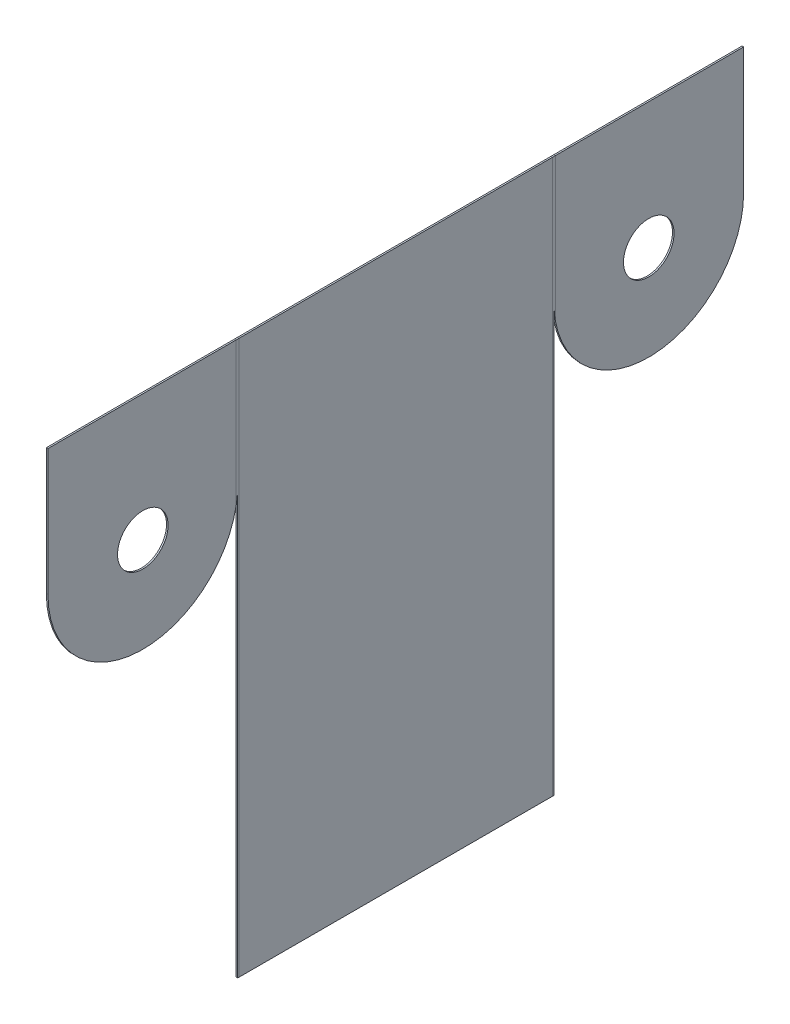
ISO-10303-21;
HEADER;
FILE_DESCRIPTION(('STEP AP214'),'2;1');
FILE_NAME('part.step','',(''),(''),'','','');
FILE_SCHEMA(('AUTOMOTIVE_DESIGN { 1 0 10303 214 1 1 1 1 }'));
ENDSEC;
DATA;
#1=APPLICATION_CONTEXT('core data for automotive mechanical design processes');
#2=APPLICATION_PROTOCOL_DEFINITION('international standard','automotive_design',2000,#1);
#3=PRODUCT_CONTEXT('',#1,'mechanical');
#4=PRODUCT('Part','Part','',(#3));
#5=PRODUCT_RELATED_PRODUCT_CATEGORY('part','',(#4));
#6=PRODUCT_DEFINITION_FORMATION('','',#4);
#7=PRODUCT_DEFINITION_CONTEXT('part definition',#1,'design');
#8=PRODUCT_DEFINITION('design','',#6,#7);
#9=PRODUCT_DEFINITION_SHAPE('','',#8);
#10=(LENGTH_UNIT() NAMED_UNIT(*) SI_UNIT(.MILLI.,.METRE.));
#11=(NAMED_UNIT(*) PLANE_ANGLE_UNIT() SI_UNIT($,.RADIAN.));
#12=(NAMED_UNIT(*) SI_UNIT($,.STERADIAN.) SOLID_ANGLE_UNIT());
#13=UNCERTAINTY_MEASURE_WITH_UNIT(LENGTH_MEASURE(1.E-05),#10,'distance_accuracy_value','');
#14=(GEOMETRIC_REPRESENTATION_CONTEXT(3) GLOBAL_UNCERTAINTY_ASSIGNED_CONTEXT((#13)) GLOBAL_UNIT_ASSIGNED_CONTEXT((#10,
#11,#12)) REPRESENTATION_CONTEXT('',''));
#15=CARTESIAN_POINT('',(0.,0.,0.));
#16=DIRECTION('',(0.,0.,1.));
#17=DIRECTION('',(1.,0.,0.));
#18=AXIS2_PLACEMENT_3D('',#15,#16,#17);
#19=CARTESIAN_POINT('',(99.2346233688582,0.,259.765376631143));
#20=DIRECTION('',(1.,0.,0.));
#21=DIRECTION('',(0.,0.,-1.));
#22=AXIS2_PLACEMENT_3D('',#19,#20,#21);
#23=PLANE('',#22);
#24=DIRECTION('',(0.,0.,1.));
#25=VECTOR('',#24,1.);
#26=CARTESIAN_POINT('',(99.2346233688569,80.,-120.234623368857));
#27=LINE('',#26,#25);
#28=CARTESIAN_POINT('',(99.2346233688573,80.,0.736600000000004));
#29=VERTEX_POINT('',#28);
#30=CARTESIAN_POINT('',(99.234623368858,80.,198.794153262285));
#31=VERTEX_POINT('',#30);
#32=EDGE_CURVE('E431',#29,#31,#27,.T.);
#33=ORIENTED_EDGE('',*,*,#32,.F.);
#34=DIRECTION('',(0.,-1.,0.));
#35=VECTOR('',#34,1.);
#36=CARTESIAN_POINT('',(99.2346233688573,0.,0.736600000000004));
#37=LINE('',#36,#35);
#38=CARTESIAN_POINT('',(99.2346233688573,-270.,0.73659999999999));
#39=VERTEX_POINT('',#38);
#40=EDGE_CURVE('E404',#29,#39,#37,.T.);
#41=ORIENTED_EDGE('',*,*,#40,.T.);
#42=DIRECTION('',(0.,0.,-1.));
#43=VECTOR('',#42,1.);
#44=CARTESIAN_POINT('',(99.2346233688573,-270.,-0.234623368857323));
#45=LINE('',#44,#43);
#46=CARTESIAN_POINT('',(99.234623368858,-270.,198.794153262285));
#47=VERTEX_POINT('',#46);
#48=EDGE_CURVE('E428',#47,#39,#45,.T.);
#49=ORIENTED_EDGE('',*,*,#48,.F.);
#50=DIRECTION('',(0.,-1.,0.));
#51=VECTOR('',#50,1.);
#52=CARTESIAN_POINT('',(99.234623368858,0.,198.794153262285));
#53=LINE('',#52,#51);
#54=EDGE_CURVE('E309',#31,#47,#53,.T.);
#55=ORIENTED_EDGE('',*,*,#54,.F.);
#56=EDGE_LOOP('',(#33,#41,#49,#55));
#57=FACE_BOUND('',#56,.T.);
#58=ADVANCED_FACE('F67',(#57),#23,.F.);
#59=CARTESIAN_POINT('',(99.2346233688573,-270.,-0.234623368857323));
#60=DIRECTION('',(0.,-1.,0.));
#61=DIRECTION('',(-1.,0.,0.));
#62=AXIS2_PLACEMENT_3D('',#59,#60,#61);
#63=PLANE('',#62);
#64=DIRECTION('',(-1.,0.,0.));
#65=VECTOR('',#64,1.);
#66=CARTESIAN_POINT('',(99.2346233688573,-270.,0.73659999999999));
#67=LINE('',#66,#65);
#68=CARTESIAN_POINT('',(100.234623368857,-270.,0.736600000000004));
#69=VERTEX_POINT('',#68);
#70=EDGE_CURVE('E312',#69,#39,#67,.T.);
#71=ORIENTED_EDGE('',*,*,#70,.F.);
#72=DIRECTION('',(0.,0.,-1.));
#73=VECTOR('',#72,1.);
#74=CARTESIAN_POINT('',(100.234623368857,-270.,-0.234623368857323));
#75=LINE('',#74,#73);
#76=CARTESIAN_POINT('',(100.234623368858,-270.,198.794153262285));
#77=VERTEX_POINT('',#76);
#78=EDGE_CURVE('E92',#77,#69,#75,.T.);
#79=ORIENTED_EDGE('',*,*,#78,.F.);
#80=DIRECTION('',(-1.,0.,0.));
#81=VECTOR('',#80,1.);
#82=CARTESIAN_POINT('',(99.234623368858,-270.,198.794153262285));
#83=LINE('',#82,#81);
#84=EDGE_CURVE('E311',#77,#47,#83,.T.);
#85=ORIENTED_EDGE('',*,*,#84,.T.);
#86=ORIENTED_EDGE('',*,*,#48,.T.);
#87=EDGE_LOOP('',(#71,#79,#85,#86));
#88=FACE_BOUND('',#87,.T.);
#89=ADVANCED_FACE('F69',(#88),#63,.T.);
#90=CARTESIAN_POINT('',(99.2346233688584,80.,319.765376631143));
#91=DIRECTION('',(0.,1.,0.));
#92=DIRECTION('',(1.,0.,0.));
#93=AXIS2_PLACEMENT_3D('',#90,#91,#92);
#94=PLANE('',#93);
#95=DIRECTION('',(1.,0.,0.));
#96=VECTOR('',#95,1.);
#97=CARTESIAN_POINT('',(99.2346233688573,80.,0.736600000000004));
#98=LINE('',#97,#96);
#99=CARTESIAN_POINT('',(100.234623368857,80.,0.736600000000004));
#100=VERTEX_POINT('',#99);
#101=EDGE_CURVE('E394',#29,#100,#98,.T.);
#102=ORIENTED_EDGE('',*,*,#101,.F.);
#103=ORIENTED_EDGE('',*,*,#32,.T.);
#104=DIRECTION('',(1.,0.,0.));
#105=VECTOR('',#104,1.);
#106=CARTESIAN_POINT('',(99.234623368858,80.,198.794153262285));
#107=LINE('',#106,#105);
#108=CARTESIAN_POINT('',(100.234623368858,80.,198.794153262285));
#109=VERTEX_POINT('',#108);
#110=EDGE_CURVE('E12',#31,#109,#107,.T.);
#111=ORIENTED_EDGE('',*,*,#110,.T.);
#112=DIRECTION('',(0.,0.,1.));
#113=VECTOR('',#112,1.);
#114=CARTESIAN_POINT('',(100.234623368858,80.,319.765376631143));
#115=LINE('',#114,#113);
#116=EDGE_CURVE('E390',#100,#109,#115,.T.);
#117=ORIENTED_EDGE('',*,*,#116,.F.);
#118=EDGE_LOOP('',(#102,#103,#111,#117));
#119=FACE_BOUND('',#118,.T.);
#120=ADVANCED_FACE('F375',(#119),#94,.T.);
#121=CARTESIAN_POINT('',(100.234623368858,0.,259.765376631143));
#122=DIRECTION('',(1.,0.,0.));
#123=DIRECTION('',(0.,0.,-1.));
#124=AXIS2_PLACEMENT_3D('',#121,#122,#123);
#125=PLANE('',#124);
#126=DIRECTION('',(0.,-1.,0.));
#127=VECTOR('',#126,1.);
#128=CARTESIAN_POINT('',(100.234623368857,0.,0.736600000000004));
#129=LINE('',#128,#127);
#130=EDGE_CURVE('E388',#100,#69,#129,.T.);
#131=ORIENTED_EDGE('',*,*,#130,.F.);
#132=ORIENTED_EDGE('',*,*,#116,.T.);
#133=DIRECTION('',(0.,-1.,0.));
#134=VECTOR('',#133,1.);
#135=CARTESIAN_POINT('',(100.234623368858,0.,198.794153262285));
#136=LINE('',#135,#134);
#137=EDGE_CURVE('E76',#109,#77,#136,.T.);
#138=ORIENTED_EDGE('',*,*,#137,.T.);
#139=ORIENTED_EDGE('',*,*,#78,.T.);
#140=EDGE_LOOP('',(#131,#132,#138,#139));
#141=FACE_BOUND('',#140,.T.);
#142=ADVANCED_FACE('F379',(#141),#125,.T.);
#143=CARTESIAN_POINT('',(99.7346233688573,80.,-0.234623368857285));
#144=DIRECTION('',(0.,-1.,0.));
#145=DIRECTION('',(0.,0.,1.));
#146=AXIS2_PLACEMENT_3D('',#143,#144,#145);
#147=PLANE('',#146);
#148=ORIENTED_EDGE('',*,*,#101,.T.);
#149=DIRECTION('',(0.,0.,1.));
#150=VECTOR('',#149,1.);
#151=CARTESIAN_POINT('',(100.234623368857,80.,-0.234623368857286));
#152=LINE('',#151,#150);
#153=CARTESIAN_POINT('',(100.234623368857,80.,-1.20584673771457));
#154=VERTEX_POINT('',#153);
#155=EDGE_CURVE('E400',#100,#154,#152,.F.);
#156=ORIENTED_EDGE('',*,*,#155,.T.);
#157=DIRECTION('',(1.,0.,0.));
#158=VECTOR('',#157,1.);
#159=CARTESIAN_POINT('',(99.2346233688573,80.,-1.20584673771457));
#160=LINE('',#159,#158);
#161=CARTESIAN_POINT('',(99.2346233688573,80.,-1.2058467377146));
#162=VERTEX_POINT('',#161);
#163=EDGE_CURVE('E463',#162,#154,#160,.T.);
#164=ORIENTED_EDGE('',*,*,#163,.F.);
#165=DIRECTION('',(0.,0.,1.));
#166=VECTOR('',#165,1.);
#167=CARTESIAN_POINT('',(99.2346233688573,80.,-0.234623368857283));
#168=LINE('',#167,#166);
#169=EDGE_CURVE('E306',#29,#162,#168,.F.);
#170=ORIENTED_EDGE('',*,*,#169,.F.);
#171=EDGE_LOOP('',(#148,#156,#164,#170));
#172=FACE_BOUND('',#171,.T.);
#173=ADVANCED_FACE('F287',(#172),#147,.F.);
#174=CARTESIAN_POINT('',(99.734623368857,1.2490009027033E-13,-60.2346233688573));
#175=DIRECTION('',(-1.,0.,0.));
#176=DIRECTION('',(0.,0.,1.));
#177=AXIS2_PLACEMENT_3D('',#174,#175,#176);
#178=CYLINDRICAL_SURFACE('',#177,60.);
#179=CARTESIAN_POINT('',(100.234623368857,-10.7519081762569,-1.20584673771456));
#180=DIRECTION('',(-1.,0.,0.));
#181=VECTOR('',#180,1.);
#182=LINE('',#179,#181);
#183=CARTESIAN_POINT('',(100.234623368857,-10.7519081762569,-1.20584673771457));
#184=VERTEX_POINT('',#183);
#185=CARTESIAN_POINT('',(99.2346233688573,-10.7519081762569,-1.20584673771457));
#186=VERTEX_POINT('',#185);
#187=EDGE_CURVE('E248',#184,#186,#182,.T.);
#188=ORIENTED_EDGE('',*,*,#187,.F.);
#189=CARTESIAN_POINT('',(100.234623368857,1.2490009027033E-13,-60.2346233688573));
#190=DIRECTION('',(-1.,0.,0.));
#191=DIRECTION('',(0.,0.,1.));
#192=AXIS2_PLACEMENT_3D('',#189,#190,#191);
#193=CIRCLE('',#192,60.);
#194=CARTESIAN_POINT('',(100.234623368857,1.25054974259178E-13,-0.234623368857285));
#195=VERTEX_POINT('',#194);
#196=EDGE_CURVE('E411',#184,#195,#193,.T.);
#197=ORIENTED_EDGE('',*,*,#196,.T.);
#198=DIRECTION('',(-1.,0.,0.));
#199=VECTOR('',#198,1.);
#200=CARTESIAN_POINT('',(99.7346233688573,1.2490009027033E-13,-0.234623368857281));
#201=LINE('',#200,#199);
#202=CARTESIAN_POINT('',(99.2346233688573,1.24745206281482E-13,-0.234623368857284));
#203=VERTEX_POINT('',#202);
#204=EDGE_CURVE('E423',#195,#203,#201,.T.);
#205=ORIENTED_EDGE('',*,*,#204,.T.);
#206=CARTESIAN_POINT('',(99.234623368857,1.2490009027033E-13,-60.2346233688573));
#207=DIRECTION('',(-1.,0.,0.));
#208=DIRECTION('',(0.,0.,1.));
#209=AXIS2_PLACEMENT_3D('',#206,#207,#208);
#210=CIRCLE('',#209,60.);
#211=EDGE_CURVE('E296',#186,#203,#210,.T.);
#212=ORIENTED_EDGE('',*,*,#211,.F.);
#213=EDGE_LOOP('',(#188,#197,#205,#212));
#214=FACE_BOUND('',#213,.T.);
#215=ADVANCED_FACE('F282',(#214),#178,.T.);
#216=CARTESIAN_POINT('',(99.7346233688573,-95.,-0.234623368857288));
#217=DIRECTION('',(0.,0.,1.));
#218=DIRECTION('',(0.,1.,0.));
#219=AXIS2_PLACEMENT_3D('',#216,#217,#218);
#220=PLANE('',#219);
#221=ORIENTED_EDGE('',*,*,#204,.F.);
#222=DIRECTION('',(0.,1.,0.));
#223=VECTOR('',#222,1.);
#224=CARTESIAN_POINT('',(100.234623368857,-95.,-0.234623368857289));
#225=LINE('',#224,#223);
#226=CARTESIAN_POINT('',(100.234623368857,-270.,-0.234623368857289));
#227=VERTEX_POINT('',#226);
#228=EDGE_CURVE('E414',#195,#227,#225,.F.);
#229=ORIENTED_EDGE('',*,*,#228,.T.);
#230=DIRECTION('',(-1.,0.,0.));
#231=VECTOR('',#230,1.);
#232=CARTESIAN_POINT('',(99.7346233688573,-270.,-0.234623368857288));
#233=LINE('',#232,#231);
#234=CARTESIAN_POINT('',(99.2346233688573,-270.,-0.234623368857286));
#235=VERTEX_POINT('',#234);
#236=EDGE_CURVE('E425',#227,#235,#233,.T.);
#237=ORIENTED_EDGE('',*,*,#236,.T.);
#238=DIRECTION('',(0.,1.,0.));
#239=VECTOR('',#238,1.);
#240=CARTESIAN_POINT('',(99.2346233688573,-95.,-0.234623368857286));
#241=LINE('',#240,#239);
#242=EDGE_CURVE('E305',#203,#235,#241,.F.);
#243=ORIENTED_EDGE('',*,*,#242,.F.);
#244=EDGE_LOOP('',(#221,#229,#237,#243));
#245=FACE_BOUND('',#244,.T.);
#246=ADVANCED_FACE('F279',(#245),#220,.F.);
#247=CARTESIAN_POINT('',(99.7346233688573,-270.,-0.234623368857285));
#248=DIRECTION('',(0.,-1.,0.));
#249=DIRECTION('',(0.,0.,1.));
#250=AXIS2_PLACEMENT_3D('',#247,#248,#249);
#251=PLANE('',#250);
#252=DIRECTION('',(0.,0.,1.));
#253=VECTOR('',#252,1.);
#254=CARTESIAN_POINT('',(100.234623368857,-270.,-0.234623368857286));
#255=LINE('',#254,#253);
#256=EDGE_CURVE('E421',#227,#69,#255,.T.);
#257=ORIENTED_EDGE('',*,*,#256,.T.);
#258=ORIENTED_EDGE('',*,*,#70,.T.);
#259=DIRECTION('',(0.,0.,1.));
#260=VECTOR('',#259,1.);
#261=CARTESIAN_POINT('',(99.2346233688573,-270.,-0.234623368857283));
#262=LINE('',#261,#260);
#263=EDGE_CURVE('E427',#235,#39,#262,.T.);
#264=ORIENTED_EDGE('',*,*,#263,.F.);
#265=ORIENTED_EDGE('',*,*,#236,.F.);
#266=EDGE_LOOP('',(#257,#258,#264,#265));
#267=FACE_BOUND('',#266,.T.);
#268=ADVANCED_FACE('F273',(#267),#251,.T.);
#269=CARTESIAN_POINT('',(99.2346233688573,-95.,-0.234623368857283));
#270=DIRECTION('',(-1.,0.,0.));
#271=DIRECTION('',(0.,0.,1.));
#272=AXIS2_PLACEMENT_3D('',#269,#270,#271);
#273=PLANE('',#272);
#274=ORIENTED_EDGE('',*,*,#242,.T.);
#275=ORIENTED_EDGE('',*,*,#263,.T.);
#276=ORIENTED_EDGE('',*,*,#40,.F.);
#277=ORIENTED_EDGE('',*,*,#169,.T.);
#278=DIRECTION('',(0.,-1.,0.));
#279=VECTOR('',#278,1.);
#280=CARTESIAN_POINT('',(99.2346233688573,0.,-1.20584673771457));
#281=LINE('',#280,#279);
#282=EDGE_CURVE('E243',#162,#186,#281,.T.);
#283=ORIENTED_EDGE('',*,*,#282,.T.);
#284=ORIENTED_EDGE('',*,*,#211,.T.);
#285=EDGE_LOOP('',(#274,#275,#276,#277,#283,#284));
#286=FACE_BOUND('',#285,.T.);
#287=ADVANCED_FACE('F269',(#286),#273,.T.);
#288=CARTESIAN_POINT('',(100.234623368857,-95.,-0.234623368857286));
#289=DIRECTION('',(-1.,0.,0.));
#290=DIRECTION('',(0.,0.,1.));
#291=AXIS2_PLACEMENT_3D('',#288,#289,#290);
#292=PLANE('',#291);
#293=ORIENTED_EDGE('',*,*,#228,.F.);
#294=ORIENTED_EDGE('',*,*,#196,.F.);
#295=DIRECTION('',(0.,-1.,0.));
#296=VECTOR('',#295,1.);
#297=CARTESIAN_POINT('',(100.234623368857,0.,-1.20584673771457));
#298=LINE('',#297,#296);
#299=EDGE_CURVE('E410',#154,#184,#298,.T.);
#300=ORIENTED_EDGE('',*,*,#299,.F.);
#301=ORIENTED_EDGE('',*,*,#155,.F.);
#302=ORIENTED_EDGE('',*,*,#130,.T.);
#303=ORIENTED_EDGE('',*,*,#256,.F.);
#304=EDGE_LOOP('',(#293,#294,#300,#301,#302,#303));
#305=FACE_BOUND('',#304,.T.);
#306=ADVANCED_FACE('F272',(#305),#292,.F.);
#307=CARTESIAN_POINT('',(99.2346233688571,0.,-60.2346233688573));
#308=DIRECTION('',(1.,0.,0.));
#309=DIRECTION('',(0.,0.,-1.));
#310=AXIS2_PLACEMENT_3D('',#307,#308,#309);
#311=CYLINDRICAL_SURFACE('',#310,16.);
#312=CARTESIAN_POINT('',(99.2346233688571,0.,-60.2346233688573));
#313=DIRECTION('',(1.,0.,0.));
#314=DIRECTION('',(0.,0.,-1.));
#315=AXIS2_PLACEMENT_3D('',#312,#313,#314);
#316=CIRCLE('',#315,16.);
#317=CARTESIAN_POINT('',(99.234623368857,0.,-76.2346233688573));
#318=VERTEX_POINT('',#317);
#319=EDGE_CURVE('E458',#318,#318,#316,.T.);
#320=ORIENTED_EDGE('',*,*,#319,.F.);
#321=EDGE_LOOP('',(#320));
#322=FACE_BOUND('',#321,.T.);
#323=CARTESIAN_POINT('',(100.234623368857,0.,-60.2346233688573));
#324=DIRECTION('',(1.,0.,0.));
#325=DIRECTION('',(0.,0.,-1.));
#326=AXIS2_PLACEMENT_3D('',#323,#324,#325);
#327=CIRCLE('',#326,16.);
#328=CARTESIAN_POINT('',(100.234623368857,0.,-76.2346233688573));
#329=VERTEX_POINT('',#328);
#330=EDGE_CURVE('E449',#329,#329,#327,.T.);
#331=ORIENTED_EDGE('',*,*,#330,.T.);
#332=EDGE_LOOP('',(#331));
#333=FACE_BOUND('',#332,.T.);
#334=ADVANCED_FACE('F277',(#322,#333),#311,.F.);
#335=CARTESIAN_POINT('',(99.2346233688569,0.,-120.234623368857));
#336=DIRECTION('',(0.,0.,-1.));
#337=DIRECTION('',(-1.,0.,0.));
#338=AXIS2_PLACEMENT_3D('',#335,#336,#337);
#339=PLANE('',#338);
#340=DIRECTION('',(0.,1.,0.));
#341=VECTOR('',#340,1.);
#342=CARTESIAN_POINT('',(100.234623368857,0.,-120.234623368857));
#343=LINE('',#342,#341);
#344=CARTESIAN_POINT('',(100.234623368857,0.,-120.234623368857));
#345=VERTEX_POINT('',#344);
#346=CARTESIAN_POINT('',(100.234623368857,80.,-120.234623368857));
#347=VERTEX_POINT('',#346);
#348=EDGE_CURVE('E475',#345,#347,#343,.T.);
#349=ORIENTED_EDGE('',*,*,#348,.F.);
#350=DIRECTION('',(1.,0.,0.));
#351=VECTOR('',#350,1.);
#352=CARTESIAN_POINT('',(99.2346233688569,0.,-120.234623368857));
#353=LINE('',#352,#351);
#354=CARTESIAN_POINT('',(99.2346233688569,0.,-120.234623368857));
#355=VERTEX_POINT('',#354);
#356=EDGE_CURVE('E254',#355,#345,#353,.T.);
#357=ORIENTED_EDGE('',*,*,#356,.F.);
#358=DIRECTION('',(0.,1.,0.));
#359=VECTOR('',#358,1.);
#360=CARTESIAN_POINT('',(99.2346233688569,0.,-120.234623368857));
#361=LINE('',#360,#359);
#362=CARTESIAN_POINT('',(99.2346233688569,80.,-120.234623368857));
#363=VERTEX_POINT('',#362);
#364=EDGE_CURVE('E452',#355,#363,#361,.T.);
#365=ORIENTED_EDGE('',*,*,#364,.T.);
#366=DIRECTION('',(1.,0.,0.));
#367=VECTOR('',#366,1.);
#368=CARTESIAN_POINT('',(99.2346233688569,80.,-120.234623368857));
#369=LINE('',#368,#367);
#370=EDGE_CURVE('E455',#363,#347,#369,.T.);
#371=ORIENTED_EDGE('',*,*,#370,.T.);
#372=EDGE_LOOP('',(#349,#357,#365,#371));
#373=FACE_BOUND('',#372,.T.);
#374=ADVANCED_FACE('F354',(#373),#339,.T.);
#375=CARTESIAN_POINT('',(99.2346233688582,0.,259.765376631143));
#376=DIRECTION('',(1.,0.,0.));
#377=DIRECTION('',(0.,0.,-1.));
#378=AXIS2_PLACEMENT_3D('',#375,#376,#377);
#379=PLANE('',#378);
#380=ORIENTED_EDGE('',*,*,#282,.F.);
#381=DIRECTION('',(0.,0.,1.));
#382=VECTOR('',#381,1.);
#383=CARTESIAN_POINT('',(99.2346233688569,80.,-120.234623368857));
#384=LINE('',#383,#382);
#385=EDGE_CURVE('E461',#363,#162,#384,.T.);
#386=ORIENTED_EDGE('',*,*,#385,.F.);
#387=ORIENTED_EDGE('',*,*,#364,.F.);
#388=CARTESIAN_POINT('',(99.2346233688571,0.,-60.2346233688573));
#389=DIRECTION('',(1.,0.,0.));
#390=DIRECTION('',(0.,0.,-1.));
#391=AXIS2_PLACEMENT_3D('',#388,#389,#390);
#392=CIRCLE('',#391,60.);
#393=EDGE_CURVE('E417',#186,#355,#392,.T.);
#394=ORIENTED_EDGE('',*,*,#393,.F.);
#395=EDGE_LOOP('',(#380,#386,#387,#394));
#396=FACE_BOUND('',#395,.T.);
#397=ORIENTED_EDGE('',*,*,#319,.T.);
#398=EDGE_LOOP('',(#397));
#399=FACE_BOUND('',#398,.T.);
#400=ADVANCED_FACE('F358',(#396,#399),#379,.F.);
#401=CARTESIAN_POINT('',(99.2346233688584,80.,319.765376631143));
#402=DIRECTION('',(0.,1.,0.));
#403=DIRECTION('',(1.,0.,0.));
#404=AXIS2_PLACEMENT_3D('',#401,#402,#403);
#405=PLANE('',#404);
#406=ORIENTED_EDGE('',*,*,#385,.T.);
#407=ORIENTED_EDGE('',*,*,#163,.T.);
#408=DIRECTION('',(0.,0.,1.));
#409=VECTOR('',#408,1.);
#410=CARTESIAN_POINT('',(100.234623368858,80.,319.765376631143));
#411=LINE('',#410,#409);
#412=EDGE_CURVE('E466',#347,#154,#411,.T.);
#413=ORIENTED_EDGE('',*,*,#412,.F.);
#414=ORIENTED_EDGE('',*,*,#370,.F.);
#415=EDGE_LOOP('',(#406,#407,#413,#414));
#416=FACE_BOUND('',#415,.T.);
#417=ADVANCED_FACE('F361',(#416),#405,.T.);
#418=CARTESIAN_POINT('',(100.234623368858,0.,259.765376631143));
#419=DIRECTION('',(1.,0.,0.));
#420=DIRECTION('',(0.,0.,-1.));
#421=AXIS2_PLACEMENT_3D('',#418,#419,#420);
#422=PLANE('',#421);
#423=ORIENTED_EDGE('',*,*,#330,.F.);
#424=EDGE_LOOP('',(#423));
#425=FACE_BOUND('',#424,.T.);
#426=ORIENTED_EDGE('',*,*,#412,.T.);
#427=ORIENTED_EDGE('',*,*,#299,.T.);
#428=CARTESIAN_POINT('',(100.234623368857,0.,-60.2346233688573));
#429=DIRECTION('',(1.,0.,0.));
#430=DIRECTION('',(0.,0.,-1.));
#431=AXIS2_PLACEMENT_3D('',#428,#429,#430);
#432=CIRCLE('',#431,60.);
#433=EDGE_CURVE('E471',#184,#345,#432,.T.);
#434=ORIENTED_EDGE('',*,*,#433,.T.);
#435=ORIENTED_EDGE('',*,*,#348,.T.);
#436=EDGE_LOOP('',(#426,#427,#434,#435));
#437=FACE_BOUND('',#436,.T.);
#438=ADVANCED_FACE('F267',(#425,#437),#422,.T.);
#439=CARTESIAN_POINT('',(99.2346233688571,0.,-60.2346233688573));
#440=DIRECTION('',(1.,0.,0.));
#441=DIRECTION('',(0.,0.,-1.));
#442=AXIS2_PLACEMENT_3D('',#439,#440,#441);
#443=CYLINDRICAL_SURFACE('',#442,60.);
#444=ORIENTED_EDGE('',*,*,#433,.F.);
#445=ORIENTED_EDGE('',*,*,#187,.T.);
#446=ORIENTED_EDGE('',*,*,#393,.T.);
#447=ORIENTED_EDGE('',*,*,#356,.T.);
#448=EDGE_LOOP('',(#444,#445,#446,#447));
#449=FACE_BOUND('',#448,.T.);
#450=ADVANCED_FACE('F256',(#449),#443,.T.);
#451=CARTESIAN_POINT('',(99.734623368858,-270.,199.765376631143));
#452=DIRECTION('',(0.,-1.,0.));
#453=DIRECTION('',(0.,0.,1.));
#454=AXIS2_PLACEMENT_3D('',#451,#452,#453);
#455=PLANE('',#454);
#456=ORIENTED_EDGE('',*,*,#84,.F.);
#457=DIRECTION('',(0.,0.,1.));
#458=VECTOR('',#457,1.);
#459=CARTESIAN_POINT('',(100.234623368858,-270.,199.765376631143));
#460=LINE('',#459,#458);
#461=CARTESIAN_POINT('',(100.234623368858,-270.,199.765376631143));
#462=VERTEX_POINT('',#461);
#463=EDGE_CURVE('E202',#77,#462,#460,.T.);
#464=ORIENTED_EDGE('',*,*,#463,.T.);
#465=DIRECTION('',(-1.,0.,0.));
#466=VECTOR('',#465,1.);
#467=CARTESIAN_POINT('',(99.734623368858,-270.,199.765376631143));
#468=LINE('',#467,#466);
#469=CARTESIAN_POINT('',(99.234623368858,-270.,199.765376631143));
#470=VERTEX_POINT('',#469);
#471=EDGE_CURVE('E241',#462,#470,#468,.T.);
#472=ORIENTED_EDGE('',*,*,#471,.T.);
#473=DIRECTION('',(0.,0.,1.));
#474=VECTOR('',#473,1.);
#475=CARTESIAN_POINT('',(99.234623368858,-270.,199.765376631143));
#476=LINE('',#475,#474);
#477=EDGE_CURVE('E226',#47,#470,#476,.T.);
#478=ORIENTED_EDGE('',*,*,#477,.F.);
#479=EDGE_LOOP('',(#456,#464,#472,#478));
#480=FACE_BOUND('',#479,.T.);
#481=ADVANCED_FACE('F266',(#480),#455,.T.);
#482=CARTESIAN_POINT('',(99.734623368858,-95.,199.765376631143));
#483=DIRECTION('',(0.,0.,1.));
#484=DIRECTION('',(0.,1.,0.));
#485=AXIS2_PLACEMENT_3D('',#482,#483,#484);
#486=PLANE('',#485);
#487=ORIENTED_EDGE('',*,*,#471,.F.);
#488=DIRECTION('',(0.,1.,0.));
#489=VECTOR('',#488,1.);
#490=CARTESIAN_POINT('',(100.234623368858,-95.,199.765376631143));
#491=LINE('',#490,#489);
#492=CARTESIAN_POINT('',(100.234623368858,0.,199.765376631143));
#493=VERTEX_POINT('',#492);
#494=EDGE_CURVE('E233',#462,#493,#491,.T.);
#495=ORIENTED_EDGE('',*,*,#494,.T.);
#496=DIRECTION('',(-1.,0.,0.));
#497=VECTOR('',#496,1.);
#498=CARTESIAN_POINT('',(99.734623368858,0.,199.765376631143));
#499=LINE('',#498,#497);
#500=CARTESIAN_POINT('',(99.234623368858,0.,199.765376631143));
#501=VERTEX_POINT('',#500);
#502=EDGE_CURVE('E232',#493,#501,#499,.T.);
#503=ORIENTED_EDGE('',*,*,#502,.T.);
#504=DIRECTION('',(0.,1.,0.));
#505=VECTOR('',#504,1.);
#506=CARTESIAN_POINT('',(99.234623368858,-95.,199.765376631143));
#507=LINE('',#506,#505);
#508=EDGE_CURVE('E222',#470,#501,#507,.T.);
#509=ORIENTED_EDGE('',*,*,#508,.F.);
#510=EDGE_LOOP('',(#487,#495,#503,#509));
#511=FACE_BOUND('',#510,.T.);
#512=ADVANCED_FACE('F340',(#511),#486,.T.);
#513=CARTESIAN_POINT('',(99.7346233688583,0.,259.765376631143));
#514=DIRECTION('',(-1.,0.,0.));
#515=DIRECTION('',(0.,0.,1.));
#516=AXIS2_PLACEMENT_3D('',#513,#514,#515);
#517=CYLINDRICAL_SURFACE('',#516,60.);
#518=ORIENTED_EDGE('',*,*,#502,.F.);
#519=CARTESIAN_POINT('',(100.234623368858,0.,259.765376631143));
#520=DIRECTION('',(-1.,0.,0.));
#521=DIRECTION('',(0.,0.,1.));
#522=AXIS2_PLACEMENT_3D('',#519,#520,#521);
#523=CIRCLE('',#522,60.);
#524=CARTESIAN_POINT('',(100.234623368858,-10.7519081762569,200.7366));
#525=VERTEX_POINT('',#524);
#526=EDGE_CURVE('E236',#493,#525,#523,.T.);
#527=ORIENTED_EDGE('',*,*,#526,.T.);
#528=CARTESIAN_POINT('',(100.234623368858,-10.7519081762569,200.7366));
#529=DIRECTION('',(-1.,0.,0.));
#530=VECTOR('',#529,1.);
#531=LINE('',#528,#530);
#532=CARTESIAN_POINT('',(99.234623368858,-10.7519081762569,200.7366));
#533=VERTEX_POINT('',#532);
#534=EDGE_CURVE('E209',#525,#533,#531,.T.);
#535=ORIENTED_EDGE('',*,*,#534,.T.);
#536=CARTESIAN_POINT('',(99.2346233688583,0.,259.765376631143));
#537=DIRECTION('',(-1.,0.,0.));
#538=DIRECTION('',(0.,0.,1.));
#539=AXIS2_PLACEMENT_3D('',#536,#537,#538);
#540=CIRCLE('',#539,60.);
#541=EDGE_CURVE('E225',#501,#533,#540,.T.);
#542=ORIENTED_EDGE('',*,*,#541,.F.);
#543=EDGE_LOOP('',(#518,#527,#535,#542));
#544=FACE_BOUND('',#543,.T.);
#545=ADVANCED_FACE('F329',(#544),#517,.T.);
#546=CARTESIAN_POINT('',(99.734623368858,80.,199.765376631143));
#547=DIRECTION('',(0.,-1.,0.));
#548=DIRECTION('',(0.,0.,1.));
#549=AXIS2_PLACEMENT_3D('',#546,#547,#548);
#550=PLANE('',#549);
#551=DIRECTION('',(0.,0.,1.));
#552=VECTOR('',#551,1.);
#553=CARTESIAN_POINT('',(100.234623368858,80.,199.765376631143));
#554=LINE('',#553,#552);
#555=CARTESIAN_POINT('',(100.234623368858,80.,200.7366));
#556=VERTEX_POINT('',#555);
#557=EDGE_CURVE('E84',#556,#109,#554,.F.);
#558=ORIENTED_EDGE('',*,*,#557,.T.);
#559=ORIENTED_EDGE('',*,*,#110,.F.);
#560=DIRECTION('',(0.,0.,1.));
#561=VECTOR('',#560,1.);
#562=CARTESIAN_POINT('',(99.234623368858,80.,199.765376631143));
#563=LINE('',#562,#561);
#564=CARTESIAN_POINT('',(99.234623368858,80.,200.7366));
#565=VERTEX_POINT('',#564);
#566=EDGE_CURVE('E229',#565,#31,#563,.F.);
#567=ORIENTED_EDGE('',*,*,#566,.F.);
#568=DIRECTION('',(1.,0.,0.));
#569=VECTOR('',#568,1.);
#570=CARTESIAN_POINT('',(99.234623368858,80.,200.7366));
#571=LINE('',#570,#569);
#572=EDGE_CURVE('E190',#565,#556,#571,.T.);
#573=ORIENTED_EDGE('',*,*,#572,.T.);
#574=EDGE_LOOP('',(#558,#559,#567,#573));
#575=FACE_BOUND('',#574,.T.);
#576=ADVANCED_FACE('F339',(#575),#550,.F.);
#577=CARTESIAN_POINT('',(99.234623368858,-95.,199.765376631143));
#578=DIRECTION('',(-1.,0.,0.));
#579=DIRECTION('',(0.,0.,1.));
#580=AXIS2_PLACEMENT_3D('',#577,#578,#579);
#581=PLANE('',#580);
#582=DIRECTION('',(0.,-1.,0.));
#583=VECTOR('',#582,1.);
#584=CARTESIAN_POINT('',(99.234623368858,0.,200.7366));
#585=LINE('',#584,#583);
#586=EDGE_CURVE('E501',#565,#533,#585,.T.);
#587=ORIENTED_EDGE('',*,*,#586,.F.);
#588=ORIENTED_EDGE('',*,*,#566,.T.);
#589=ORIENTED_EDGE('',*,*,#54,.T.);
#590=ORIENTED_EDGE('',*,*,#477,.T.);
#591=ORIENTED_EDGE('',*,*,#508,.T.);
#592=ORIENTED_EDGE('',*,*,#541,.T.);
#593=EDGE_LOOP('',(#587,#588,#589,#590,#591,#592));
#594=FACE_BOUND('',#593,.T.);
#595=ADVANCED_FACE('F351',(#594),#581,.T.);
#596=CARTESIAN_POINT('',(100.234623368858,-95.,199.765376631143));
#597=DIRECTION('',(-1.,0.,0.));
#598=DIRECTION('',(0.,0.,1.));
#599=AXIS2_PLACEMENT_3D('',#596,#597,#598);
#600=PLANE('',#599);
#601=DIRECTION('',(0.,-1.,0.));
#602=VECTOR('',#601,1.);
#603=CARTESIAN_POINT('',(100.234623368858,0.,200.7366));
#604=LINE('',#603,#602);
#605=EDGE_CURVE('E214',#556,#525,#604,.T.);
#606=ORIENTED_EDGE('',*,*,#605,.T.);
#607=ORIENTED_EDGE('',*,*,#526,.F.);
#608=ORIENTED_EDGE('',*,*,#494,.F.);
#609=ORIENTED_EDGE('',*,*,#463,.F.);
#610=ORIENTED_EDGE('',*,*,#137,.F.);
#611=ORIENTED_EDGE('',*,*,#557,.F.);
#612=EDGE_LOOP('',(#606,#607,#608,#609,#610,#611));
#613=FACE_BOUND('',#612,.T.);
#614=ADVANCED_FACE('F341',(#613),#600,.F.);
#615=CARTESIAN_POINT('',(99.2346233688584,0.,319.765376631143));
#616=DIRECTION('',(0.,0.,1.));
#617=DIRECTION('',(1.,0.,0.));
#618=AXIS2_PLACEMENT_3D('',#615,#616,#617);
#619=PLANE('',#618);
#620=DIRECTION('',(0.,-1.,0.));
#621=VECTOR('',#620,1.);
#622=CARTESIAN_POINT('',(100.234623368858,0.,319.765376631143));
#623=LINE('',#622,#621);
#624=CARTESIAN_POINT('',(100.234623368858,80.,319.765376631143));
#625=VERTEX_POINT('',#624);
#626=CARTESIAN_POINT('',(100.234623368858,0.,319.765376631143));
#627=VERTEX_POINT('',#626);
#628=EDGE_CURVE('E201',#625,#627,#623,.T.);
#629=ORIENTED_EDGE('',*,*,#628,.F.);
#630=DIRECTION('',(1.,0.,0.));
#631=VECTOR('',#630,1.);
#632=CARTESIAN_POINT('',(99.2346233688584,80.,319.765376631143));
#633=LINE('',#632,#631);
#634=CARTESIAN_POINT('',(99.2346233688584,80.,319.765376631143));
#635=VERTEX_POINT('',#634);
#636=EDGE_CURVE('E188',#635,#625,#633,.T.);
#637=ORIENTED_EDGE('',*,*,#636,.F.);
#638=DIRECTION('',(0.,-1.,0.));
#639=VECTOR('',#638,1.);
#640=CARTESIAN_POINT('',(99.2346233688584,0.,319.765376631143));
#641=LINE('',#640,#639);
#642=CARTESIAN_POINT('',(99.2346233688584,0.,319.765376631143));
#643=VERTEX_POINT('',#642);
#644=EDGE_CURVE('E199',#635,#643,#641,.T.);
#645=ORIENTED_EDGE('',*,*,#644,.T.);
#646=DIRECTION('',(1.,0.,0.));
#647=VECTOR('',#646,1.);
#648=CARTESIAN_POINT('',(99.2346233688584,0.,319.765376631143));
#649=LINE('',#648,#647);
#650=EDGE_CURVE('E208',#643,#627,#649,.T.);
#651=ORIENTED_EDGE('',*,*,#650,.T.);
#652=EDGE_LOOP('',(#629,#637,#645,#651));
#653=FACE_BOUND('',#652,.T.);
#654=ADVANCED_FACE('F198',(#653),#619,.T.);
#655=CARTESIAN_POINT('',(99.2346233688582,0.,259.765376631143));
#656=DIRECTION('',(1.,0.,0.));
#657=DIRECTION('',(0.,0.,-1.));
#658=AXIS2_PLACEMENT_3D('',#655,#656,#657);
#659=CYLINDRICAL_SURFACE('',#658,16.);
#660=CARTESIAN_POINT('',(99.2346233688582,0.,259.765376631143));
#661=DIRECTION('',(1.,0.,0.));
#662=DIRECTION('',(0.,0.,-1.));
#663=AXIS2_PLACEMENT_3D('',#660,#661,#662);
#664=CIRCLE('',#663,16.);
#665=CARTESIAN_POINT('',(99.2346233688581,0.,243.765376631143));
#666=VERTEX_POINT('',#665);
#667=EDGE_CURVE('E549',#666,#666,#664,.T.);
#668=ORIENTED_EDGE('',*,*,#667,.F.);
#669=EDGE_LOOP('',(#668));
#670=FACE_BOUND('',#669,.T.);
#671=CARTESIAN_POINT('',(100.234623368858,0.,259.765376631143));
#672=DIRECTION('',(1.,0.,0.));
#673=DIRECTION('',(0.,0.,-1.));
#674=AXIS2_PLACEMENT_3D('',#671,#672,#673);
#675=CIRCLE('',#674,16.);
#676=CARTESIAN_POINT('',(100.234623368858,0.,243.765376631143));
#677=VERTEX_POINT('',#676);
#678=EDGE_CURVE('E211',#677,#677,#675,.T.);
#679=ORIENTED_EDGE('',*,*,#678,.T.);
#680=EDGE_LOOP('',(#679));
#681=FACE_BOUND('',#680,.T.);
#682=ADVANCED_FACE('F536',(#670,#681),#659,.F.);
#683=CARTESIAN_POINT('',(99.2346233688582,0.,259.765376631143));
#684=DIRECTION('',(1.,0.,0.));
#685=DIRECTION('',(0.,0.,-1.));
#686=AXIS2_PLACEMENT_3D('',#683,#684,#685);
#687=PLANE('',#686);
#688=ORIENTED_EDGE('',*,*,#667,.T.);
#689=EDGE_LOOP('',(#688));
#690=FACE_BOUND('',#689,.T.);
#691=DIRECTION('',(0.,0.,1.));
#692=VECTOR('',#691,1.);
#693=CARTESIAN_POINT('',(99.2346233688569,80.,-120.234623368857));
#694=LINE('',#693,#692);
#695=EDGE_CURVE('E185',#565,#635,#694,.T.);
#696=ORIENTED_EDGE('',*,*,#695,.F.);
#697=ORIENTED_EDGE('',*,*,#586,.T.);
#698=CARTESIAN_POINT('',(99.2346233688582,0.,259.765376631143));
#699=DIRECTION('',(1.,0.,0.));
#700=DIRECTION('',(0.,0.,-1.));
#701=AXIS2_PLACEMENT_3D('',#698,#699,#700);
#702=CIRCLE('',#701,60.);
#703=EDGE_CURVE('E207',#643,#533,#702,.T.);
#704=ORIENTED_EDGE('',*,*,#703,.F.);
#705=ORIENTED_EDGE('',*,*,#644,.F.);
#706=EDGE_LOOP('',(#696,#697,#704,#705));
#707=FACE_BOUND('',#706,.T.);
#708=ADVANCED_FACE('F205',(#690,#707),#687,.F.);
#709=CARTESIAN_POINT('',(99.2346233688582,0.,259.765376631143));
#710=DIRECTION('',(1.,0.,0.));
#711=DIRECTION('',(0.,0.,-1.));
#712=AXIS2_PLACEMENT_3D('',#709,#710,#711);
#713=CYLINDRICAL_SURFACE('',#712,60.);
#714=ORIENTED_EDGE('',*,*,#534,.F.);
#715=CARTESIAN_POINT('',(100.234623368858,0.,259.765376631143));
#716=DIRECTION('',(1.,0.,0.));
#717=DIRECTION('',(0.,0.,-1.));
#718=AXIS2_PLACEMENT_3D('',#715,#716,#717);
#719=CIRCLE('',#718,60.);
#720=EDGE_CURVE('E194',#627,#525,#719,.T.);
#721=ORIENTED_EDGE('',*,*,#720,.F.);
#722=ORIENTED_EDGE('',*,*,#650,.F.);
#723=ORIENTED_EDGE('',*,*,#703,.T.);
#724=EDGE_LOOP('',(#714,#721,#722,#723));
#725=FACE_BOUND('',#724,.T.);
#726=ADVANCED_FACE('F511',(#725),#713,.T.);
#727=CARTESIAN_POINT('',(100.234623368858,0.,259.765376631143));
#728=DIRECTION('',(1.,0.,0.));
#729=DIRECTION('',(0.,0.,-1.));
#730=AXIS2_PLACEMENT_3D('',#727,#728,#729);
#731=PLANE('',#730);
#732=ORIENTED_EDGE('',*,*,#605,.F.);
#733=DIRECTION('',(0.,0.,1.));
#734=VECTOR('',#733,1.);
#735=CARTESIAN_POINT('',(100.234623368858,80.,319.765376631143));
#736=LINE('',#735,#734);
#737=EDGE_CURVE('E506',#556,#625,#736,.T.);
#738=ORIENTED_EDGE('',*,*,#737,.T.);
#739=ORIENTED_EDGE('',*,*,#628,.T.);
#740=ORIENTED_EDGE('',*,*,#720,.T.);
#741=EDGE_LOOP('',(#732,#738,#739,#740));
#742=FACE_BOUND('',#741,.T.);
#743=ORIENTED_EDGE('',*,*,#678,.F.);
#744=EDGE_LOOP('',(#743));
#745=FACE_BOUND('',#744,.T.);
#746=ADVANCED_FACE('F504',(#742,#745),#731,.T.);
#747=CARTESIAN_POINT('',(99.2346233688584,80.,319.765376631143));
#748=DIRECTION('',(0.,1.,0.));
#749=DIRECTION('',(1.,0.,0.));
#750=AXIS2_PLACEMENT_3D('',#747,#748,#749);
#751=PLANE('',#750);
#752=ORIENTED_EDGE('',*,*,#572,.F.);
#753=ORIENTED_EDGE('',*,*,#695,.T.);
#754=ORIENTED_EDGE('',*,*,#636,.T.);
#755=ORIENTED_EDGE('',*,*,#737,.F.);
#756=EDGE_LOOP('',(#752,#753,#754,#755));
#757=FACE_BOUND('',#756,.T.);
#758=ADVANCED_FACE('F187',(#757),#751,.T.);
#759=CLOSED_SHELL('',(#58,#89,#120,#142,#173,#215,#246,#268,#287,#306,#334,#374,#400,#417,#438,
#450,#481,#512,#545,#576,#595,#614,#654,#682,#708,#726,#746,#758));
#760=MANIFOLD_SOLID_BREP('B2',#759);
#761=ADVANCED_BREP_SHAPE_REPRESENTATION('',(#18,#760),#14);
#762=SHAPE_DEFINITION_REPRESENTATION(#9,#761);
ENDSEC;
END-ISO-10303-21;
